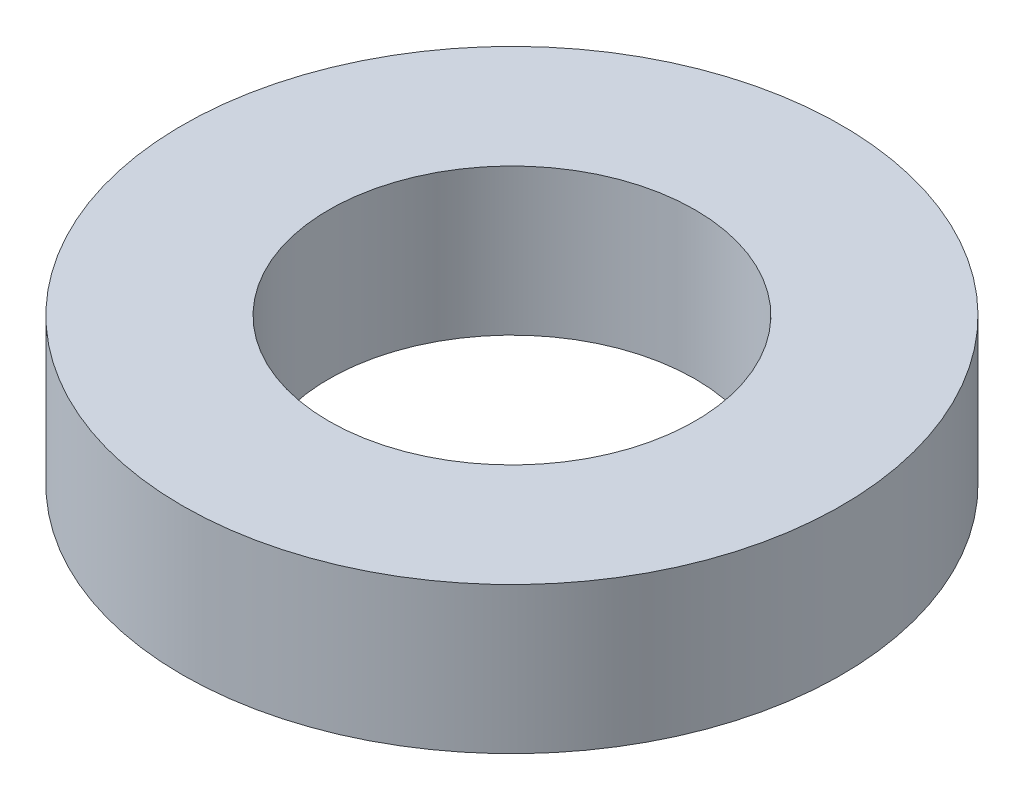
ISO-10303-21;
HEADER;
FILE_DESCRIPTION(('STEP AP214'),'2;1');
FILE_NAME('part.step','',(''),(''),'','','');
FILE_SCHEMA(('AUTOMOTIVE_DESIGN { 1 0 10303 214 1 1 1 1 }'));
ENDSEC;
DATA;
#1=APPLICATION_CONTEXT('core data for automotive mechanical design processes');
#2=APPLICATION_PROTOCOL_DEFINITION('international standard','automotive_design',2000,#1);
#3=PRODUCT_CONTEXT('',#1,'mechanical');
#4=PRODUCT('Part','Part','',(#3));
#5=PRODUCT_RELATED_PRODUCT_CATEGORY('part','',(#4));
#6=PRODUCT_DEFINITION_FORMATION('','',#4);
#7=PRODUCT_DEFINITION_CONTEXT('part definition',#1,'design');
#8=PRODUCT_DEFINITION('design','',#6,#7);
#9=PRODUCT_DEFINITION_SHAPE('','',#8);
#10=(LENGTH_UNIT() NAMED_UNIT(*) SI_UNIT(.MILLI.,.METRE.));
#11=(NAMED_UNIT(*) PLANE_ANGLE_UNIT() SI_UNIT($,.RADIAN.));
#12=(NAMED_UNIT(*) SI_UNIT($,.STERADIAN.) SOLID_ANGLE_UNIT());
#13=UNCERTAINTY_MEASURE_WITH_UNIT(LENGTH_MEASURE(1.E-05),#10,'distance_accuracy_value','');
#14=(GEOMETRIC_REPRESENTATION_CONTEXT(3) GLOBAL_UNCERTAINTY_ASSIGNED_CONTEXT((#13)) GLOBAL_UNIT_ASSIGNED_CONTEXT((#10,
#11,#12)) REPRESENTATION_CONTEXT('',''));
#15=CARTESIAN_POINT('',(0.,0.,0.));
#16=DIRECTION('',(0.,0.,1.));
#17=DIRECTION('',(1.,0.,0.));
#18=AXIS2_PLACEMENT_3D('',#15,#16,#17);
#19=CARTESIAN_POINT('',(0.,12.7,0.));
#20=DIRECTION('',(0.,1.,0.));
#21=DIRECTION('',(0.,0.,1.));
#22=AXIS2_PLACEMENT_3D('',#19,#20,#21);
#23=PLANE('',#22);
#24=CARTESIAN_POINT('',(0.,12.7,0.));
#25=DIRECTION('',(0.,1.,0.));
#26=DIRECTION('',(0.,0.,1.));
#27=AXIS2_PLACEMENT_3D('',#24,#25,#26);
#28=CIRCLE('',#27,28.575);
#29=CARTESIAN_POINT('',(0.,12.7,28.575));
#30=VERTEX_POINT('',#29);
#31=EDGE_CURVE('E10',#30,#30,#28,.T.);
#32=ORIENTED_EDGE('',*,*,#31,.T.);
#33=EDGE_LOOP('',(#32));
#34=FACE_BOUND('',#33,.T.);
#35=CARTESIAN_POINT('',(0.,12.7,0.));
#36=DIRECTION('',(0.,1.,0.));
#37=DIRECTION('',(0.,0.,1.));
#38=AXIS2_PLACEMENT_3D('',#35,#36,#37);
#39=CIRCLE('',#38,15.875);
#40=CARTESIAN_POINT('',(0.,12.7,15.875));
#41=VERTEX_POINT('',#40);
#42=EDGE_CURVE('E42',#41,#41,#39,.T.);
#43=ORIENTED_EDGE('',*,*,#42,.F.);
#44=EDGE_LOOP('',(#43));
#45=FACE_BOUND('',#44,.T.);
#46=ADVANCED_FACE('F31',(#34,#45),#23,.T.);
#47=CARTESIAN_POINT('',(0.,0.,0.));
#48=DIRECTION('',(0.,1.,0.));
#49=DIRECTION('',(0.,0.,1.));
#50=AXIS2_PLACEMENT_3D('',#47,#48,#49);
#51=PLANE('',#50);
#52=CARTESIAN_POINT('',(0.,0.,0.));
#53=DIRECTION('',(0.,1.,0.));
#54=DIRECTION('',(0.,0.,1.));
#55=AXIS2_PLACEMENT_3D('',#52,#53,#54);
#56=CIRCLE('',#55,28.575);
#57=CARTESIAN_POINT('',(0.,0.,28.575));
#58=VERTEX_POINT('',#57);
#59=EDGE_CURVE('E35',#58,#58,#56,.T.);
#60=ORIENTED_EDGE('',*,*,#59,.F.);
#61=EDGE_LOOP('',(#60));
#62=FACE_BOUND('',#61,.T.);
#63=CARTESIAN_POINT('',(0.,0.,0.));
#64=DIRECTION('',(0.,1.,0.));
#65=DIRECTION('',(0.,0.,1.));
#66=AXIS2_PLACEMENT_3D('',#63,#64,#65);
#67=CIRCLE('',#66,15.875);
#68=CARTESIAN_POINT('',(0.,0.,15.875));
#69=VERTEX_POINT('',#68);
#70=EDGE_CURVE('E44',#69,#69,#67,.T.);
#71=ORIENTED_EDGE('',*,*,#70,.T.);
#72=EDGE_LOOP('',(#71));
#73=FACE_BOUND('',#72,.T.);
#74=ADVANCED_FACE('F54',(#62,#73),#51,.F.);
#75=CARTESIAN_POINT('',(0.,12.7,0.));
#76=DIRECTION('',(0.,-1.,0.));
#77=DIRECTION('',(0.,0.,-1.));
#78=AXIS2_PLACEMENT_3D('',#75,#76,#77);
#79=CYLINDRICAL_SURFACE('',#78,28.575);
#80=ORIENTED_EDGE('',*,*,#31,.F.);
#81=EDGE_LOOP('',(#80));
#82=FACE_BOUND('',#81,.T.);
#83=ORIENTED_EDGE('',*,*,#59,.T.);
#84=EDGE_LOOP('',(#83));
#85=FACE_BOUND('',#84,.T.);
#86=ADVANCED_FACE('F33',(#82,#85),#79,.T.);
#87=CARTESIAN_POINT('',(0.,12.7,0.));
#88=DIRECTION('',(0.,-1.,0.));
#89=DIRECTION('',(0.,0.,-1.));
#90=AXIS2_PLACEMENT_3D('',#87,#88,#89);
#91=CYLINDRICAL_SURFACE('',#90,15.875);
#92=ORIENTED_EDGE('',*,*,#42,.T.);
#93=EDGE_LOOP('',(#92));
#94=FACE_BOUND('',#93,.T.);
#95=ORIENTED_EDGE('',*,*,#70,.F.);
#96=EDGE_LOOP('',(#95));
#97=FACE_BOUND('',#96,.T.);
#98=ADVANCED_FACE('F50',(#94,#97),#91,.F.);
#99=CLOSED_SHELL('',(#46,#74,#86,#98));
#100=MANIFOLD_SOLID_BREP('B2',#99);
#101=ADVANCED_BREP_SHAPE_REPRESENTATION('',(#18,#100),#14);
#102=SHAPE_DEFINITION_REPRESENTATION(#9,#101);
ENDSEC;
END-ISO-10303-21;
